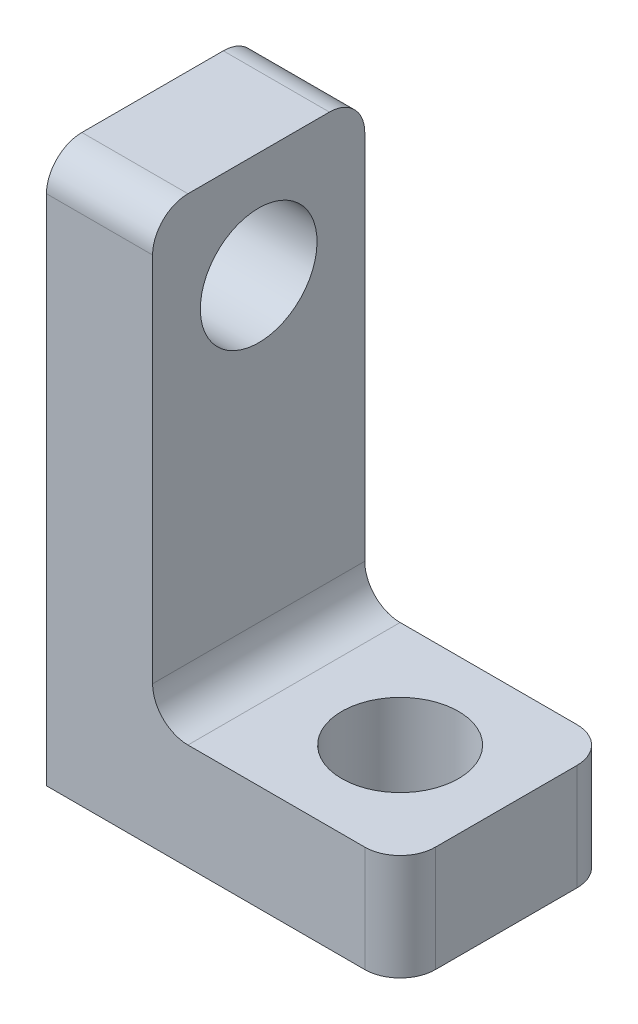
ISO-10303-21;
HEADER;
FILE_DESCRIPTION(('STEP AP214'),'2;1');
FILE_NAME('part.step','',(''),(''),'','','');
FILE_SCHEMA(('AUTOMOTIVE_DESIGN { 1 0 10303 214 1 1 1 1 }'));
ENDSEC;
DATA;
#1=APPLICATION_CONTEXT('core data for automotive mechanical design processes');
#2=APPLICATION_PROTOCOL_DEFINITION('international standard','automotive_design',2000,#1);
#3=PRODUCT_CONTEXT('',#1,'mechanical');
#4=PRODUCT('Part','Part','',(#3));
#5=PRODUCT_RELATED_PRODUCT_CATEGORY('part','',(#4));
#6=PRODUCT_DEFINITION_FORMATION('','',#4);
#7=PRODUCT_DEFINITION_CONTEXT('part definition',#1,'design');
#8=PRODUCT_DEFINITION('design','',#6,#7);
#9=PRODUCT_DEFINITION_SHAPE('','',#8);
#10=(LENGTH_UNIT() NAMED_UNIT(*) SI_UNIT(.MILLI.,.METRE.));
#11=(NAMED_UNIT(*) PLANE_ANGLE_UNIT() SI_UNIT($,.RADIAN.));
#12=(NAMED_UNIT(*) SI_UNIT($,.STERADIAN.) SOLID_ANGLE_UNIT());
#13=UNCERTAINTY_MEASURE_WITH_UNIT(LENGTH_MEASURE(1.E-05),#10,'distance_accuracy_value','');
#14=(GEOMETRIC_REPRESENTATION_CONTEXT(3) GLOBAL_UNCERTAINTY_ASSIGNED_CONTEXT((#13)) GLOBAL_UNIT_ASSIGNED_CONTEXT((#10,
#11,#12)) REPRESENTATION_CONTEXT('',''));
#15=CARTESIAN_POINT('',(0.,0.,0.));
#16=DIRECTION('',(0.,0.,1.));
#17=DIRECTION('',(1.,0.,0.));
#18=AXIS2_PLACEMENT_3D('',#15,#16,#17);
#19=CARTESIAN_POINT('',(10.,3.,6.));
#20=DIRECTION('',(-1.,0.,0.));
#21=DIRECTION('',(0.,-1.,0.));
#22=AXIS2_PLACEMENT_3D('',#19,#20,#21);
#23=PLANE('',#22);
#24=DIRECTION('',(0.,0.,-1.));
#25=VECTOR('',#24,1.);
#26=CARTESIAN_POINT('',(10.,0.,6.));
#27=LINE('',#26,#25);
#28=CARTESIAN_POINT('',(10.,0.,5.));
#29=VERTEX_POINT('',#28);
#30=CARTESIAN_POINT('',(10.,0.,1.));
#31=VERTEX_POINT('',#30);
#32=EDGE_CURVE('E142',#29,#31,#27,.T.);
#33=ORIENTED_EDGE('',*,*,#32,.T.);
#34=DIRECTION('',(0.,1.,0.));
#35=VECTOR('',#34,1.);
#36=CARTESIAN_POINT('',(10.,3.,1.));
#37=LINE('',#36,#35);
#38=CARTESIAN_POINT('',(10.,3.,1.));
#39=VERTEX_POINT('',#38);
#40=EDGE_CURVE('E178',#31,#39,#37,.T.);
#41=ORIENTED_EDGE('',*,*,#40,.T.);
#42=DIRECTION('',(0.,0.,-1.));
#43=VECTOR('',#42,1.);
#44=CARTESIAN_POINT('',(10.,3.,6.));
#45=LINE('',#44,#43);
#46=CARTESIAN_POINT('',(10.,3.,5.));
#47=VERTEX_POINT('',#46);
#48=EDGE_CURVE('E166',#47,#39,#45,.T.);
#49=ORIENTED_EDGE('',*,*,#48,.F.);
#50=DIRECTION('',(0.,1.,0.));
#51=VECTOR('',#50,1.);
#52=CARTESIAN_POINT('',(10.,3.,5.));
#53=LINE('',#52,#51);
#54=EDGE_CURVE('E169',#47,#29,#53,.F.);
#55=ORIENTED_EDGE('',*,*,#54,.T.);
#56=EDGE_LOOP('',(#33,#41,#49,#55));
#57=FACE_BOUND('',#56,.T.);
#58=ADVANCED_FACE('F34',(#57),#23,.F.);
#59=CARTESIAN_POINT('',(3.,3.,6.));
#60=DIRECTION('',(0.,-1.,0.));
#61=DIRECTION('',(0.,0.,-1.));
#62=AXIS2_PLACEMENT_3D('',#59,#60,#61);
#63=PLANE('',#62);
#64=CARTESIAN_POINT('',(7.,3.,3.));
#65=DIRECTION('',(0.,1.,0.));
#66=DIRECTION('',(0.,0.,1.));
#67=AXIS2_PLACEMENT_3D('',#64,#65,#66);
#68=CIRCLE('',#67,1.65);
#69=CARTESIAN_POINT('',(7.,3.,4.65));
#70=VERTEX_POINT('',#69);
#71=EDGE_CURVE('E176',#70,#70,#68,.T.);
#72=ORIENTED_EDGE('',*,*,#71,.F.);
#73=EDGE_LOOP('',(#72));
#74=FACE_BOUND('',#73,.T.);
#75=ORIENTED_EDGE('',*,*,#48,.T.);
#76=CARTESIAN_POINT('',(9.,3.,1.));
#77=DIRECTION('',(0.,-1.,0.));
#78=DIRECTION('',(0.,0.,-1.));
#79=AXIS2_PLACEMENT_3D('',#76,#77,#78);
#80=CIRCLE('',#79,1.);
#81=CARTESIAN_POINT('',(9.,3.,0.));
#82=VERTEX_POINT('',#81);
#83=EDGE_CURVE('E185',#39,#82,#80,.F.);
#84=ORIENTED_EDGE('',*,*,#83,.T.);
#85=DIRECTION('',(-1.,0.,0.));
#86=VECTOR('',#85,1.);
#87=CARTESIAN_POINT('',(3.,3.,0.));
#88=LINE('',#87,#86);
#89=CARTESIAN_POINT('',(4.,3.,0.));
#90=VERTEX_POINT('',#89);
#91=EDGE_CURVE('E153',#82,#90,#88,.T.);
#92=ORIENTED_EDGE('',*,*,#91,.T.);
#93=DIRECTION('',(0.,0.,-1.));
#94=VECTOR('',#93,1.);
#95=CARTESIAN_POINT('',(4.,3.,6.));
#96=LINE('',#95,#94);
#97=CARTESIAN_POINT('',(4.,3.,6.));
#98=VERTEX_POINT('',#97);
#99=EDGE_CURVE('E181',#90,#98,#96,.F.);
#100=ORIENTED_EDGE('',*,*,#99,.T.);
#101=DIRECTION('',(-1.,0.,0.));
#102=VECTOR('',#101,1.);
#103=CARTESIAN_POINT('',(3.,3.,6.));
#104=LINE('',#103,#102);
#105=CARTESIAN_POINT('',(9.,3.,6.));
#106=VERTEX_POINT('',#105);
#107=EDGE_CURVE('E161',#106,#98,#104,.T.);
#108=ORIENTED_EDGE('',*,*,#107,.F.);
#109=CARTESIAN_POINT('',(9.,3.,5.));
#110=DIRECTION('',(0.,-1.,0.));
#111=DIRECTION('',(0.,0.,-1.));
#112=AXIS2_PLACEMENT_3D('',#109,#110,#111);
#113=CIRCLE('',#112,1.);
#114=EDGE_CURVE('E183',#106,#47,#113,.F.);
#115=ORIENTED_EDGE('',*,*,#114,.T.);
#116=EDGE_LOOP('',(#75,#84,#92,#100,#108,#115));
#117=FACE_BOUND('',#116,.T.);
#118=ADVANCED_FACE('F219',(#74,#117),#63,.F.);
#119=CARTESIAN_POINT('',(3.,15.5,6.));
#120=DIRECTION('',(-1.,0.,0.));
#121=DIRECTION('',(0.,-1.,0.));
#122=AXIS2_PLACEMENT_3D('',#119,#120,#121);
#123=PLANE('',#122);
#124=CARTESIAN_POINT('',(3.,12.5,3.));
#125=DIRECTION('',(1.,0.,0.));
#126=DIRECTION('',(0.,1.,0.));
#127=AXIS2_PLACEMENT_3D('',#124,#125,#126);
#128=CIRCLE('',#127,1.65);
#129=CARTESIAN_POINT('',(3.,14.15,3.));
#130=VERTEX_POINT('',#129);
#131=EDGE_CURVE('E172',#130,#130,#128,.T.);
#132=ORIENTED_EDGE('',*,*,#131,.F.);
#133=EDGE_LOOP('',(#132));
#134=FACE_BOUND('',#133,.T.);
#135=DIRECTION('',(0.,1.,0.));
#136=VECTOR('',#135,1.);
#137=CARTESIAN_POINT('',(3.,15.5,0.));
#138=LINE('',#137,#136);
#139=CARTESIAN_POINT('',(3.,4.,0.));
#140=VERTEX_POINT('',#139);
#141=CARTESIAN_POINT('',(3.,14.5,0.));
#142=VERTEX_POINT('',#141);
#143=EDGE_CURVE('E156',#140,#142,#138,.T.);
#144=ORIENTED_EDGE('',*,*,#143,.T.);
#145=CARTESIAN_POINT('',(3.,14.5,1.));
#146=DIRECTION('',(-1.,0.,0.));
#147=DIRECTION('',(0.,-1.,0.));
#148=AXIS2_PLACEMENT_3D('',#145,#146,#147);
#149=CIRCLE('',#148,1.);
#150=CARTESIAN_POINT('',(3.,15.5,1.));
#151=VERTEX_POINT('',#150);
#152=EDGE_CURVE('E49',#142,#151,#149,.F.);
#153=ORIENTED_EDGE('',*,*,#152,.T.);
#154=DIRECTION('',(0.,0.,-1.));
#155=VECTOR('',#154,1.);
#156=CARTESIAN_POINT('',(3.,15.5,6.));
#157=LINE('',#156,#155);
#158=CARTESIAN_POINT('',(3.,15.5,5.));
#159=VERTEX_POINT('',#158);
#160=EDGE_CURVE('E164',#159,#151,#157,.T.);
#161=ORIENTED_EDGE('',*,*,#160,.F.);
#162=CARTESIAN_POINT('',(3.,14.5,5.));
#163=DIRECTION('',(-1.,0.,0.));
#164=DIRECTION('',(0.,-1.,0.));
#165=AXIS2_PLACEMENT_3D('',#162,#163,#164);
#166=CIRCLE('',#165,1.);
#167=CARTESIAN_POINT('',(3.,14.5,6.));
#168=VERTEX_POINT('',#167);
#169=EDGE_CURVE('E208',#159,#168,#166,.F.);
#170=ORIENTED_EDGE('',*,*,#169,.T.);
#171=DIRECTION('',(0.,1.,0.));
#172=VECTOR('',#171,1.);
#173=CARTESIAN_POINT('',(3.,15.5,6.));
#174=LINE('',#173,#172);
#175=CARTESIAN_POINT('',(3.,4.,6.));
#176=VERTEX_POINT('',#175);
#177=EDGE_CURVE('E130',#176,#168,#174,.T.);
#178=ORIENTED_EDGE('',*,*,#177,.F.);
#179=DIRECTION('',(0.,0.,-1.));
#180=VECTOR('',#179,1.);
#181=CARTESIAN_POINT('',(3.,4.,0.));
#182=LINE('',#181,#180);
#183=EDGE_CURVE('E205',#176,#140,#182,.T.);
#184=ORIENTED_EDGE('',*,*,#183,.T.);
#185=EDGE_LOOP('',(#144,#153,#161,#170,#178,#184));
#186=FACE_BOUND('',#185,.T.);
#187=ADVANCED_FACE('F224',(#134,#186),#123,.F.);
#188=CARTESIAN_POINT('',(0.,15.5,6.));
#189=DIRECTION('',(0.,-1.,0.));
#190=DIRECTION('',(0.,0.,-1.));
#191=AXIS2_PLACEMENT_3D('',#188,#189,#190);
#192=PLANE('',#191);
#193=ORIENTED_EDGE('',*,*,#160,.T.);
#194=DIRECTION('',(-1.,0.,0.));
#195=VECTOR('',#194,1.);
#196=CARTESIAN_POINT('',(0.,15.5,1.));
#197=LINE('',#196,#195);
#198=CARTESIAN_POINT('',(0.,15.5,1.));
#199=VERTEX_POINT('',#198);
#200=EDGE_CURVE('E198',#151,#199,#197,.T.);
#201=ORIENTED_EDGE('',*,*,#200,.T.);
#202=DIRECTION('',(0.,0.,-1.));
#203=VECTOR('',#202,1.);
#204=CARTESIAN_POINT('',(0.,15.5,6.));
#205=LINE('',#204,#203);
#206=CARTESIAN_POINT('',(0.,15.5,5.));
#207=VERTEX_POINT('',#206);
#208=EDGE_CURVE('E141',#207,#199,#205,.T.);
#209=ORIENTED_EDGE('',*,*,#208,.F.);
#210=DIRECTION('',(-1.,0.,0.));
#211=VECTOR('',#210,1.);
#212=CARTESIAN_POINT('',(0.,15.5,5.));
#213=LINE('',#212,#211);
#214=EDGE_CURVE('E56',#207,#159,#213,.F.);
#215=ORIENTED_EDGE('',*,*,#214,.T.);
#216=EDGE_LOOP('',(#193,#201,#209,#215));
#217=FACE_BOUND('',#216,.T.);
#218=ADVANCED_FACE('F242',(#217),#192,.F.);
#219=CARTESIAN_POINT('',(0.,0.,6.));
#220=DIRECTION('',(1.,0.,0.));
#221=DIRECTION('',(0.,0.,-1.));
#222=AXIS2_PLACEMENT_3D('',#219,#220,#221);
#223=PLANE('',#222);
#224=CARTESIAN_POINT('',(0.,12.5,3.));
#225=DIRECTION('',(1.,0.,0.));
#226=DIRECTION('',(0.,0.,-1.));
#227=AXIS2_PLACEMENT_3D('',#224,#225,#226);
#228=CIRCLE('',#227,1.65);
#229=CARTESIAN_POINT('',(0.,12.5,1.35));
#230=VERTEX_POINT('',#229);
#231=EDGE_CURVE('E157',#230,#230,#228,.T.);
#232=ORIENTED_EDGE('',*,*,#231,.T.);
#233=EDGE_LOOP('',(#232));
#234=FACE_BOUND('',#233,.T.);
#235=ORIENTED_EDGE('',*,*,#208,.T.);
#236=CARTESIAN_POINT('',(0.,14.5,1.));
#237=DIRECTION('',(1.,0.,0.));
#238=DIRECTION('',(0.,0.,-1.));
#239=AXIS2_PLACEMENT_3D('',#236,#237,#238);
#240=CIRCLE('',#239,1.);
#241=CARTESIAN_POINT('',(0.,14.5,0.));
#242=VERTEX_POINT('',#241);
#243=EDGE_CURVE('E203',#199,#242,#240,.F.);
#244=ORIENTED_EDGE('',*,*,#243,.T.);
#245=DIRECTION('',(0.,-1.,0.));
#246=VECTOR('',#245,1.);
#247=CARTESIAN_POINT('',(0.,0.,0.));
#248=LINE('',#247,#246);
#249=CARTESIAN_POINT('',(0.,0.,0.));
#250=VERTEX_POINT('',#249);
#251=EDGE_CURVE('E137',#242,#250,#248,.T.);
#252=ORIENTED_EDGE('',*,*,#251,.T.);
#253=DIRECTION('',(0.,0.,-1.));
#254=VECTOR('',#253,1.);
#255=CARTESIAN_POINT('',(0.,0.,6.));
#256=LINE('',#255,#254);
#257=CARTESIAN_POINT('',(0.,0.,6.));
#258=VERTEX_POINT('',#257);
#259=EDGE_CURVE('E133',#258,#250,#256,.T.);
#260=ORIENTED_EDGE('',*,*,#259,.F.);
#261=DIRECTION('',(0.,-1.,0.));
#262=VECTOR('',#261,1.);
#263=CARTESIAN_POINT('',(0.,0.,6.));
#264=LINE('',#263,#262);
#265=CARTESIAN_POINT('',(0.,14.5,6.));
#266=VERTEX_POINT('',#265);
#267=EDGE_CURVE('E119',#266,#258,#264,.T.);
#268=ORIENTED_EDGE('',*,*,#267,.F.);
#269=CARTESIAN_POINT('',(0.,14.5,5.));
#270=DIRECTION('',(1.,0.,0.));
#271=DIRECTION('',(0.,0.,-1.));
#272=AXIS2_PLACEMENT_3D('',#269,#270,#271);
#273=CIRCLE('',#272,1.);
#274=EDGE_CURVE('E201',#266,#207,#273,.F.);
#275=ORIENTED_EDGE('',*,*,#274,.T.);
#276=EDGE_LOOP('',(#235,#244,#252,#260,#268,#275));
#277=FACE_BOUND('',#276,.T.);
#278=ADVANCED_FACE('F135',(#234,#277),#223,.F.);
#279=CARTESIAN_POINT('',(10.,0.,6.));
#280=DIRECTION('',(0.,1.,0.));
#281=DIRECTION('',(0.,0.,1.));
#282=AXIS2_PLACEMENT_3D('',#279,#280,#281);
#283=PLANE('',#282);
#284=CARTESIAN_POINT('',(7.,0.,3.));
#285=DIRECTION('',(0.,1.,0.));
#286=DIRECTION('',(0.,0.,1.));
#287=AXIS2_PLACEMENT_3D('',#284,#285,#286);
#288=CIRCLE('',#287,1.65);
#289=CARTESIAN_POINT('',(7.,0.,4.65));
#290=VERTEX_POINT('',#289);
#291=EDGE_CURVE('E173',#290,#290,#288,.T.);
#292=ORIENTED_EDGE('',*,*,#291,.T.);
#293=EDGE_LOOP('',(#292));
#294=FACE_BOUND('',#293,.T.);
#295=DIRECTION('',(1.,0.,0.));
#296=VECTOR('',#295,1.);
#297=CARTESIAN_POINT('',(10.,0.,0.));
#298=LINE('',#297,#296);
#299=CARTESIAN_POINT('',(9.,0.,0.));
#300=VERTEX_POINT('',#299);
#301=EDGE_CURVE('E160',#250,#300,#298,.T.);
#302=ORIENTED_EDGE('',*,*,#301,.T.);
#303=CARTESIAN_POINT('',(9.,0.,1.));
#304=DIRECTION('',(0.,1.,0.));
#305=DIRECTION('',(0.,0.,1.));
#306=AXIS2_PLACEMENT_3D('',#303,#304,#305);
#307=CIRCLE('',#306,1.);
#308=EDGE_CURVE('E192',#300,#31,#307,.F.);
#309=ORIENTED_EDGE('',*,*,#308,.T.);
#310=ORIENTED_EDGE('',*,*,#32,.F.);
#311=CARTESIAN_POINT('',(9.,0.,5.));
#312=DIRECTION('',(0.,1.,0.));
#313=DIRECTION('',(0.,0.,1.));
#314=AXIS2_PLACEMENT_3D('',#311,#312,#313);
#315=CIRCLE('',#314,1.);
#316=CARTESIAN_POINT('',(9.,0.,6.));
#317=VERTEX_POINT('',#316);
#318=EDGE_CURVE('E147',#29,#317,#315,.F.);
#319=ORIENTED_EDGE('',*,*,#318,.T.);
#320=DIRECTION('',(1.,0.,0.));
#321=VECTOR('',#320,1.);
#322=CARTESIAN_POINT('',(10.,0.,6.));
#323=LINE('',#322,#321);
#324=EDGE_CURVE('E124',#258,#317,#323,.T.);
#325=ORIENTED_EDGE('',*,*,#324,.F.);
#326=ORIENTED_EDGE('',*,*,#259,.T.);
#327=EDGE_LOOP('',(#302,#309,#310,#319,#325,#326));
#328=FACE_BOUND('',#327,.T.);
#329=ADVANCED_FACE('F144',(#294,#328),#283,.F.);
#330=CARTESIAN_POINT('',(0.,0.,6.));
#331=DIRECTION('',(0.,0.,-1.));
#332=DIRECTION('',(-1.,0.,0.));
#333=AXIS2_PLACEMENT_3D('',#330,#331,#332);
#334=PLANE('',#333);
#335=ORIENTED_EDGE('',*,*,#324,.T.);
#336=DIRECTION('',(0.,1.,0.));
#337=VECTOR('',#336,1.);
#338=CARTESIAN_POINT('',(9.,0.,6.));
#339=LINE('',#338,#337);
#340=EDGE_CURVE('E195',#317,#106,#339,.T.);
#341=ORIENTED_EDGE('',*,*,#340,.T.);
#342=ORIENTED_EDGE('',*,*,#107,.T.);
#343=CARTESIAN_POINT('',(4.,4.,6.));
#344=DIRECTION('',(0.,0.,-1.));
#345=DIRECTION('',(-1.,0.,0.));
#346=AXIS2_PLACEMENT_3D('',#343,#344,#345);
#347=CIRCLE('',#346,1.);
#348=EDGE_CURVE('E11',#98,#176,#347,.T.);
#349=ORIENTED_EDGE('',*,*,#348,.T.);
#350=ORIENTED_EDGE('',*,*,#177,.T.);
#351=DIRECTION('',(-1.,0.,0.));
#352=VECTOR('',#351,1.);
#353=CARTESIAN_POINT('',(0.,14.5,6.));
#354=LINE('',#353,#352);
#355=EDGE_CURVE('E128',#168,#266,#354,.T.);
#356=ORIENTED_EDGE('',*,*,#355,.T.);
#357=ORIENTED_EDGE('',*,*,#267,.T.);
#358=EDGE_LOOP('',(#335,#341,#342,#349,#350,#356,#357));
#359=FACE_BOUND('',#358,.T.);
#360=ADVANCED_FACE('F121',(#359),#334,.F.);
#361=CARTESIAN_POINT('',(0.,0.,0.));
#362=DIRECTION('',(0.,0.,-1.));
#363=DIRECTION('',(-1.,0.,0.));
#364=AXIS2_PLACEMENT_3D('',#361,#362,#363);
#365=PLANE('',#364);
#366=ORIENTED_EDGE('',*,*,#91,.F.);
#367=DIRECTION('',(0.,1.,0.));
#368=VECTOR('',#367,1.);
#369=CARTESIAN_POINT('',(9.,0.,0.));
#370=LINE('',#369,#368);
#371=EDGE_CURVE('E189',#82,#300,#370,.F.);
#372=ORIENTED_EDGE('',*,*,#371,.T.);
#373=ORIENTED_EDGE('',*,*,#301,.F.);
#374=ORIENTED_EDGE('',*,*,#251,.F.);
#375=DIRECTION('',(-1.,0.,0.));
#376=VECTOR('',#375,1.);
#377=CARTESIAN_POINT('',(3.,14.5,0.));
#378=LINE('',#377,#376);
#379=EDGE_CURVE('E187',#242,#142,#378,.F.);
#380=ORIENTED_EDGE('',*,*,#379,.T.);
#381=ORIENTED_EDGE('',*,*,#143,.F.);
#382=CARTESIAN_POINT('',(4.,4.,0.));
#383=DIRECTION('',(0.,0.,-1.));
#384=DIRECTION('',(-1.,0.,0.));
#385=AXIS2_PLACEMENT_3D('',#382,#383,#384);
#386=CIRCLE('',#385,1.);
#387=EDGE_CURVE('E42',#140,#90,#386,.F.);
#388=ORIENTED_EDGE('',*,*,#387,.T.);
#389=EDGE_LOOP('',(#366,#372,#373,#374,#380,#381,#388));
#390=FACE_BOUND('',#389,.T.);
#391=ADVANCED_FACE('F213',(#390),#365,.T.);
#392=CARTESIAN_POINT('',(-3.,12.5,3.));
#393=DIRECTION('',(1.,0.,0.));
#394=DIRECTION('',(0.,1.,0.));
#395=AXIS2_PLACEMENT_3D('',#392,#393,#394);
#396=CYLINDRICAL_SURFACE('',#395,1.65);
#397=ORIENTED_EDGE('',*,*,#131,.T.);
#398=EDGE_LOOP('',(#397));
#399=FACE_BOUND('',#398,.T.);
#400=ORIENTED_EDGE('',*,*,#231,.F.);
#401=EDGE_LOOP('',(#400));
#402=FACE_BOUND('',#401,.T.);
#403=ADVANCED_FACE('F284',(#399,#402),#396,.F.);
#404=CARTESIAN_POINT('',(7.,-3.,3.));
#405=DIRECTION('',(0.,1.,0.));
#406=DIRECTION('',(0.,0.,1.));
#407=AXIS2_PLACEMENT_3D('',#404,#405,#406);
#408=CYLINDRICAL_SURFACE('',#407,1.65);
#409=ORIENTED_EDGE('',*,*,#71,.T.);
#410=EDGE_LOOP('',(#409));
#411=FACE_BOUND('',#410,.T.);
#412=ORIENTED_EDGE('',*,*,#291,.F.);
#413=EDGE_LOOP('',(#412));
#414=FACE_BOUND('',#413,.T.);
#415=ADVANCED_FACE('F233',(#411,#414),#408,.F.);
#416=CARTESIAN_POINT('',(9.,3.,1.));
#417=DIRECTION('',(0.,-1.,0.));
#418=DIRECTION('',(1.,0.,0.));
#419=AXIS2_PLACEMENT_3D('',#416,#417,#418);
#420=CYLINDRICAL_SURFACE('',#419,1.);
#421=ORIENTED_EDGE('',*,*,#308,.F.);
#422=ORIENTED_EDGE('',*,*,#371,.F.);
#423=ORIENTED_EDGE('',*,*,#83,.F.);
#424=ORIENTED_EDGE('',*,*,#40,.F.);
#425=EDGE_LOOP('',(#421,#422,#423,#424));
#426=FACE_BOUND('',#425,.T.);
#427=ADVANCED_FACE('F249',(#426),#420,.T.);
#428=CARTESIAN_POINT('',(9.,0.,5.));
#429=DIRECTION('',(0.,1.,0.));
#430=DIRECTION('',(-1.,0.,0.));
#431=AXIS2_PLACEMENT_3D('',#428,#429,#430);
#432=CYLINDRICAL_SURFACE('',#431,1.);
#433=ORIENTED_EDGE('',*,*,#318,.F.);
#434=ORIENTED_EDGE('',*,*,#54,.F.);
#435=ORIENTED_EDGE('',*,*,#114,.F.);
#436=ORIENTED_EDGE('',*,*,#340,.F.);
#437=EDGE_LOOP('',(#433,#434,#435,#436));
#438=FACE_BOUND('',#437,.T.);
#439=ADVANCED_FACE('F252',(#438),#432,.T.);
#440=CARTESIAN_POINT('',(0.,14.5,1.));
#441=DIRECTION('',(1.,0.,0.));
#442=DIRECTION('',(0.,0.,-1.));
#443=AXIS2_PLACEMENT_3D('',#440,#441,#442);
#444=CYLINDRICAL_SURFACE('',#443,1.);
#445=ORIENTED_EDGE('',*,*,#152,.F.);
#446=ORIENTED_EDGE('',*,*,#379,.F.);
#447=ORIENTED_EDGE('',*,*,#243,.F.);
#448=ORIENTED_EDGE('',*,*,#200,.F.);
#449=EDGE_LOOP('',(#445,#446,#447,#448));
#450=FACE_BOUND('',#449,.T.);
#451=ADVANCED_FACE('F256',(#450),#444,.T.);
#452=CARTESIAN_POINT('',(0.,14.5,5.));
#453=DIRECTION('',(-1.,0.,0.));
#454=DIRECTION('',(0.,0.,1.));
#455=AXIS2_PLACEMENT_3D('',#452,#453,#454);
#456=CYLINDRICAL_SURFACE('',#455,1.);
#457=ORIENTED_EDGE('',*,*,#169,.F.);
#458=ORIENTED_EDGE('',*,*,#214,.F.);
#459=ORIENTED_EDGE('',*,*,#274,.F.);
#460=ORIENTED_EDGE('',*,*,#355,.F.);
#461=EDGE_LOOP('',(#457,#458,#459,#460));
#462=FACE_BOUND('',#461,.T.);
#463=ADVANCED_FACE('F259',(#462),#456,.T.);
#464=CARTESIAN_POINT('',(4.,4.,6.));
#465=DIRECTION('',(0.,0.,1.));
#466=DIRECTION('',(1.,0.,0.));
#467=AXIS2_PLACEMENT_3D('',#464,#465,#466);
#468=CYLINDRICAL_SURFACE('',#467,1.);
#469=ORIENTED_EDGE('',*,*,#348,.F.);
#470=ORIENTED_EDGE('',*,*,#99,.F.);
#471=ORIENTED_EDGE('',*,*,#387,.F.);
#472=ORIENTED_EDGE('',*,*,#183,.F.);
#473=EDGE_LOOP('',(#469,#470,#471,#472));
#474=FACE_BOUND('',#473,.T.);
#475=ADVANCED_FACE('F36',(#474),#468,.F.);
#476=CLOSED_SHELL('',(#58,#118,#187,#218,#278,#329,#360,#391,#403,#415,#427,#439,#451,#463,#475));
#477=MANIFOLD_SOLID_BREP('B2',#476);
#478=ADVANCED_BREP_SHAPE_REPRESENTATION('',(#18,#477),#14);
#479=SHAPE_DEFINITION_REPRESENTATION(#9,#478);
ENDSEC;
END-ISO-10303-21;
